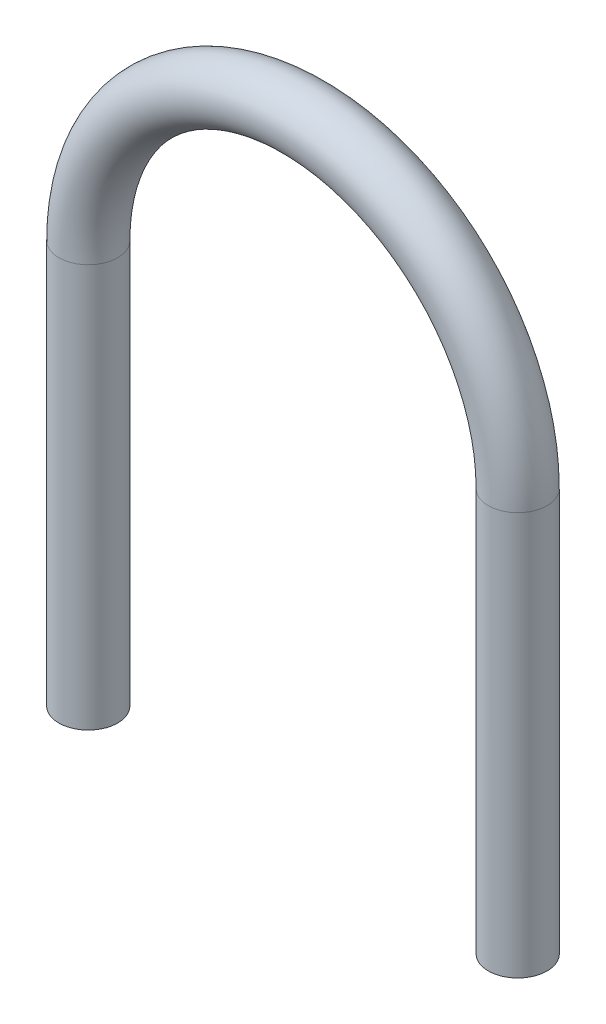
ISO-10303-21;
HEADER;
FILE_DESCRIPTION(('STEP AP214'),'2;1');
FILE_NAME('part.step','',(''),(''),'','','');
FILE_SCHEMA(('AUTOMOTIVE_DESIGN { 1 0 10303 214 1 1 1 1 }'));
ENDSEC;
DATA;
#1=APPLICATION_CONTEXT('core data for automotive mechanical design processes');
#2=APPLICATION_PROTOCOL_DEFINITION('international standard','automotive_design',2000,#1);
#3=PRODUCT_CONTEXT('',#1,'mechanical');
#4=PRODUCT('Part','Part','',(#3));
#5=PRODUCT_RELATED_PRODUCT_CATEGORY('part','',(#4));
#6=PRODUCT_DEFINITION_FORMATION('','',#4);
#7=PRODUCT_DEFINITION_CONTEXT('part definition',#1,'design');
#8=PRODUCT_DEFINITION('design','',#6,#7);
#9=PRODUCT_DEFINITION_SHAPE('','',#8);
#10=(LENGTH_UNIT() NAMED_UNIT(*) SI_UNIT(.MILLI.,.METRE.));
#11=(NAMED_UNIT(*) PLANE_ANGLE_UNIT() SI_UNIT($,.RADIAN.));
#12=(NAMED_UNIT(*) SI_UNIT($,.STERADIAN.) SOLID_ANGLE_UNIT());
#13=UNCERTAINTY_MEASURE_WITH_UNIT(LENGTH_MEASURE(1.E-05),#10,'distance_accuracy_value','');
#14=(GEOMETRIC_REPRESENTATION_CONTEXT(3) GLOBAL_UNCERTAINTY_ASSIGNED_CONTEXT((#13)) GLOBAL_UNIT_ASSIGNED_CONTEXT((#10,
#11,#12)) REPRESENTATION_CONTEXT('',''));
#15=CARTESIAN_POINT('',(0.,0.,0.));
#16=DIRECTION('',(0.,0.,1.));
#17=DIRECTION('',(1.,0.,0.));
#18=AXIS2_PLACEMENT_3D('',#15,#16,#17);
#19=CARTESIAN_POINT('',(-28.969,0.,0.));
#20=DIRECTION('',(0.,-1.,0.));
#21=DIRECTION('',(0.,0.,1.));
#22=AXIS2_PLACEMENT_3D('',#19,#20,#21);
#23=PLANE('',#22);
#24=CARTESIAN_POINT('',(-28.969,0.,0.));
#25=DIRECTION('',(0.,-1.,0.));
#26=DIRECTION('',(0.,0.,1.));
#27=AXIS2_PLACEMENT_3D('',#24,#25,#26);
#28=CIRCLE('',#27,3.969);
#29=CARTESIAN_POINT('',(-28.969,0.,3.96899999999999));
#30=VERTEX_POINT('',#29);
#31=EDGE_CURVE('E49',#30,#30,#28,.T.);
#32=ORIENTED_EDGE('',*,*,#31,.T.);
#33=EDGE_LOOP('',(#32));
#34=FACE_BOUND('',#33,.T.);
#35=ADVANCED_FACE('F37',(#34),#23,.T.);
#36=CARTESIAN_POINT('',(28.969,0.,0.));
#37=DIRECTION('',(0.,1.,0.));
#38=DIRECTION('',(0.,0.,1.));
#39=AXIS2_PLACEMENT_3D('',#36,#37,#38);
#40=PLANE('',#39);
#41=CARTESIAN_POINT('',(28.969,0.,0.));
#42=DIRECTION('',(0.,1.,0.));
#43=DIRECTION('',(0.,0.,1.));
#44=AXIS2_PLACEMENT_3D('',#41,#42,#43);
#45=CIRCLE('',#44,3.969);
#46=CARTESIAN_POINT('',(28.969,0.,3.96899999999999));
#47=VERTEX_POINT('',#46);
#48=EDGE_CURVE('E11',#47,#47,#45,.T.);
#49=ORIENTED_EDGE('',*,*,#48,.F.);
#50=EDGE_LOOP('',(#49));
#51=FACE_BOUND('',#50,.T.);
#52=ADVANCED_FACE('F55',(#51),#40,.F.);
#53=CARTESIAN_POINT('',(-28.969,0.,0.));
#54=DIRECTION('',(0.,1.,0.));
#55=DIRECTION('',(0.,0.,1.));
#56=AXIS2_PLACEMENT_3D('',#53,#54,#55);
#57=CYLINDRICAL_SURFACE('',#56,3.969);
#58=CARTESIAN_POINT('',(-28.969,54.369,0.));
#59=DIRECTION('',(0.,-1.,0.));
#60=DIRECTION('',(0.,0.,1.));
#61=AXIS2_PLACEMENT_3D('',#58,#59,#60);
#62=CIRCLE('',#61,3.969);
#63=CARTESIAN_POINT('',(-32.938,54.369,0.));
#64=VERTEX_POINT('',#63);
#65=EDGE_CURVE('E80',#64,#64,#62,.T.);
#66=ORIENTED_EDGE('',*,*,#65,.T.);
#67=EDGE_LOOP('',(#66));
#68=FACE_BOUND('',#67,.T.);
#69=ORIENTED_EDGE('',*,*,#31,.F.);
#70=EDGE_LOOP('',(#69));
#71=FACE_BOUND('',#70,.T.);
#72=ADVANCED_FACE('F57',(#68,#71),#57,.T.);
#73=CARTESIAN_POINT('',(0.,54.369,0.));
#74=DIRECTION('',(0.,0.,-1.));
#75=DIRECTION('',(-1.,0.,0.));
#76=AXIS2_PLACEMENT_3D('',#73,#74,#75);
#77=TOROIDAL_SURFACE('',#76,28.969,3.969);
#78=CARTESIAN_POINT('',(28.969,54.369,0.));
#79=DIRECTION('',(0.,1.,0.));
#80=DIRECTION('',(0.,0.,1.));
#81=AXIS2_PLACEMENT_3D('',#78,#79,#80);
#82=CIRCLE('',#81,3.969);
#83=CARTESIAN_POINT('',(32.938,54.369,0.));
#84=VERTEX_POINT('',#83);
#85=EDGE_CURVE('E44',#84,#84,#82,.T.);
#86=CARTESIAN_POINT('',(0.,54.369,0.));
#87=DIRECTION('',(0.,0.,-1.));
#88=DIRECTION('',(-1.,0.,0.));
#89=AXIS2_PLACEMENT_3D('',#86,#87,#88);
#90=CIRCLE('',#89,32.938);
#91=EDGE_CURVE('',#64,#84,#90,.T.);
#92=ORIENTED_EDGE('',*,*,#65,.F.);
#93=ORIENTED_EDGE('',*,*,#85,.T.);
#94=ORIENTED_EDGE('',*,*,#91,.T.);
#95=ORIENTED_EDGE('',*,*,#91,.F.);
#96=EDGE_LOOP('',(#92,#94,#93,#95));
#97=FACE_BOUND('',#96,.T.);
#98=ADVANCED_FACE('F62',(#97),#77,.T.);
#99=CARTESIAN_POINT('',(28.969,54.369,0.));
#100=DIRECTION('',(0.,-1.,0.));
#101=DIRECTION('',(0.,0.,-1.));
#102=AXIS2_PLACEMENT_3D('',#99,#100,#101);
#103=CYLINDRICAL_SURFACE('',#102,3.969);
#104=ORIENTED_EDGE('',*,*,#48,.T.);
#105=EDGE_LOOP('',(#104));
#106=FACE_BOUND('',#105,.T.);
#107=ORIENTED_EDGE('',*,*,#85,.F.);
#108=EDGE_LOOP('',(#107));
#109=FACE_BOUND('',#108,.T.);
#110=ADVANCED_FACE('F52',(#106,#109),#103,.T.);
#111=CLOSED_SHELL('',(#35,#52,#72,#98,#110));
#112=MANIFOLD_SOLID_BREP('B2',#111);
#113=ADVANCED_BREP_SHAPE_REPRESENTATION('',(#18,#112),#14);
#114=SHAPE_DEFINITION_REPRESENTATION(#9,#113);
ENDSEC;
END-ISO-10303-21;
